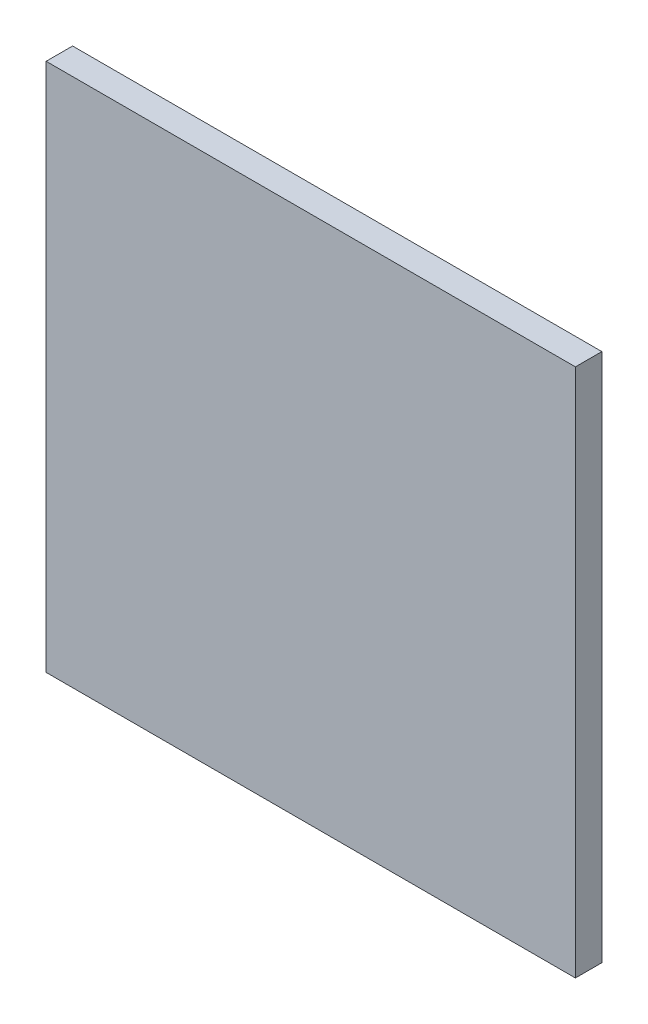
ISO-10303-21;
HEADER;
FILE_DESCRIPTION(('STEP AP214'),'2;1');
FILE_NAME('part.step','',(''),(''),'','','');
FILE_SCHEMA(('AUTOMOTIVE_DESIGN { 1 0 10303 214 1 1 1 1 }'));
ENDSEC;
DATA;
#1=APPLICATION_CONTEXT('core data for automotive mechanical design processes');
#2=APPLICATION_PROTOCOL_DEFINITION('international standard','automotive_design',2000,#1);
#3=PRODUCT_CONTEXT('',#1,'mechanical');
#4=PRODUCT('Part','Part','',(#3));
#5=PRODUCT_RELATED_PRODUCT_CATEGORY('part','',(#4));
#6=PRODUCT_DEFINITION_FORMATION('','',#4);
#7=PRODUCT_DEFINITION_CONTEXT('part definition',#1,'design');
#8=PRODUCT_DEFINITION('design','',#6,#7);
#9=PRODUCT_DEFINITION_SHAPE('','',#8);
#10=(LENGTH_UNIT() NAMED_UNIT(*) SI_UNIT(.MILLI.,.METRE.));
#11=(NAMED_UNIT(*) PLANE_ANGLE_UNIT() SI_UNIT($,.RADIAN.));
#12=(NAMED_UNIT(*) SI_UNIT($,.STERADIAN.) SOLID_ANGLE_UNIT());
#13=UNCERTAINTY_MEASURE_WITH_UNIT(LENGTH_MEASURE(1.E-05),#10,'distance_accuracy_value','');
#14=(GEOMETRIC_REPRESENTATION_CONTEXT(3) GLOBAL_UNCERTAINTY_ASSIGNED_CONTEXT((#13)) GLOBAL_UNIT_ASSIGNED_CONTEXT((#10,
#11,#12)) REPRESENTATION_CONTEXT('',''));
#15=CARTESIAN_POINT('',(0.,0.,0.));
#16=DIRECTION('',(0.,0.,1.));
#17=DIRECTION('',(1.,0.,0.));
#18=AXIS2_PLACEMENT_3D('',#15,#16,#17);
#19=CARTESIAN_POINT('',(-5.00000016,5.00000016,0.50009806));
#20=DIRECTION('',(0.,0.,1.));
#21=DIRECTION('',(1.,0.,0.));
#22=AXIS2_PLACEMENT_3D('',#19,#20,#21);
#23=PLANE('',#22);
#24=DIRECTION('',(0.,1.,0.));
#25=VECTOR('',#24,1.);
#26=CARTESIAN_POINT('',(5.00000016,5.00000016,0.50009806));
#27=LINE('',#26,#25);
#28=CARTESIAN_POINT('',(5.00000016,5.00000016,0.50009806));
#29=VERTEX_POINT('',#28);
#30=CARTESIAN_POINT('',(5.00000016,-5.00000016,0.50009806));
#31=VERTEX_POINT('',#30);
#32=EDGE_CURVE('E53',#29,#31,#27,.F.);
#33=ORIENTED_EDGE('',*,*,#32,.F.);
#34=DIRECTION('',(1.,0.,0.));
#35=VECTOR('',#34,1.);
#36=CARTESIAN_POINT('',(-5.00000016,5.00000016,0.50009806));
#37=LINE('',#36,#35);
#38=CARTESIAN_POINT('',(-5.00000016,5.00000016,0.50009806));
#39=VERTEX_POINT('',#38);
#40=EDGE_CURVE('E68',#39,#29,#37,.T.);
#41=ORIENTED_EDGE('',*,*,#40,.F.);
#42=DIRECTION('',(0.,1.,0.));
#43=VECTOR('',#42,1.);
#44=CARTESIAN_POINT('',(-5.00000016,-5.00000016,0.50009806));
#45=LINE('',#44,#43);
#46=CARTESIAN_POINT('',(-5.00000016,-5.00000016,0.50009806));
#47=VERTEX_POINT('',#46);
#48=EDGE_CURVE('E20',#47,#39,#45,.T.);
#49=ORIENTED_EDGE('',*,*,#48,.F.);
#50=DIRECTION('',(1.,0.,0.));
#51=VECTOR('',#50,1.);
#52=CARTESIAN_POINT('',(5.00000016,-5.00000016,0.50009806));
#53=LINE('',#52,#51);
#54=EDGE_CURVE('E58',#31,#47,#53,.F.);
#55=ORIENTED_EDGE('',*,*,#54,.F.);
#56=EDGE_LOOP('',(#33,#41,#49,#55));
#57=FACE_BOUND('',#56,.T.);
#58=ADVANCED_FACE('F17',(#57),#23,.T.);
#59=CARTESIAN_POINT('',(-5.00000016,-5.00000016,0.));
#60=DIRECTION('',(-1.,0.,0.));
#61=DIRECTION('',(0.,0.,1.));
#62=AXIS2_PLACEMENT_3D('',#59,#60,#61);
#63=PLANE('',#62);
#64=DIRECTION('',(0.,0.,1.));
#65=VECTOR('',#64,1.);
#66=CARTESIAN_POINT('',(-5.00000016,5.00000016,0.));
#67=LINE('',#66,#65);
#68=CARTESIAN_POINT('',(-5.00000016,5.00000016,0.));
#69=VERTEX_POINT('',#68);
#70=EDGE_CURVE('E79',#69,#39,#67,.T.);
#71=ORIENTED_EDGE('',*,*,#70,.F.);
#72=DIRECTION('',(0.,1.,0.));
#73=VECTOR('',#72,1.);
#74=CARTESIAN_POINT('',(-5.00000016,5.00000016,0.));
#75=LINE('',#74,#73);
#76=CARTESIAN_POINT('',(-5.00000016,-5.00000016,0.));
#77=VERTEX_POINT('',#76);
#78=EDGE_CURVE('E74',#69,#77,#75,.F.);
#79=ORIENTED_EDGE('',*,*,#78,.T.);
#80=DIRECTION('',(0.,0.,-1.));
#81=VECTOR('',#80,1.);
#82=CARTESIAN_POINT('',(-5.00000016,-5.00000016,0.));
#83=LINE('',#82,#81);
#84=EDGE_CURVE('E63',#47,#77,#83,.T.);
#85=ORIENTED_EDGE('',*,*,#84,.F.);
#86=ORIENTED_EDGE('',*,*,#48,.T.);
#87=EDGE_LOOP('',(#71,#79,#85,#86));
#88=FACE_BOUND('',#87,.T.);
#89=ADVANCED_FACE('F73',(#88),#63,.T.);
#90=CARTESIAN_POINT('',(5.00000016,-5.00000016,0.));
#91=DIRECTION('',(0.,-1.,0.));
#92=DIRECTION('',(0.,0.,-1.));
#93=AXIS2_PLACEMENT_3D('',#90,#91,#92);
#94=PLANE('',#93);
#95=ORIENTED_EDGE('',*,*,#84,.T.);
#96=DIRECTION('',(1.,0.,0.));
#97=VECTOR('',#96,1.);
#98=CARTESIAN_POINT('',(-5.00000016,-5.00000016,0.));
#99=LINE('',#98,#97);
#100=CARTESIAN_POINT('',(5.00000016,-5.00000016,0.));
#101=VERTEX_POINT('',#100);
#102=EDGE_CURVE('E84',#77,#101,#99,.T.);
#103=ORIENTED_EDGE('',*,*,#102,.T.);
#104=DIRECTION('',(0.,0.,-1.));
#105=VECTOR('',#104,1.);
#106=CARTESIAN_POINT('',(5.00000016,-5.00000016,0.));
#107=LINE('',#106,#105);
#108=EDGE_CURVE('E65',#31,#101,#107,.T.);
#109=ORIENTED_EDGE('',*,*,#108,.F.);
#110=ORIENTED_EDGE('',*,*,#54,.T.);
#111=EDGE_LOOP('',(#95,#103,#109,#110));
#112=FACE_BOUND('',#111,.T.);
#113=ADVANCED_FACE('F60',(#112),#94,.T.);
#114=CARTESIAN_POINT('',(5.00000016,5.00000016,0.));
#115=DIRECTION('',(1.,0.,0.));
#116=DIRECTION('',(0.,0.,-1.));
#117=AXIS2_PLACEMENT_3D('',#114,#115,#116);
#118=PLANE('',#117);
#119=ORIENTED_EDGE('',*,*,#108,.T.);
#120=DIRECTION('',(0.,1.,0.));
#121=VECTOR('',#120,1.);
#122=CARTESIAN_POINT('',(5.00000016,5.00000016,0.));
#123=LINE('',#122,#121);
#124=CARTESIAN_POINT('',(5.00000016,5.00000016,0.));
#125=VERTEX_POINT('',#124);
#126=EDGE_CURVE('E26',#101,#125,#123,.T.);
#127=ORIENTED_EDGE('',*,*,#126,.T.);
#128=DIRECTION('',(0.,0.,1.));
#129=VECTOR('',#128,1.);
#130=CARTESIAN_POINT('',(5.00000016,5.00000016,0.));
#131=LINE('',#130,#129);
#132=EDGE_CURVE('E34',#29,#125,#131,.F.);
#133=ORIENTED_EDGE('',*,*,#132,.F.);
#134=ORIENTED_EDGE('',*,*,#32,.T.);
#135=EDGE_LOOP('',(#119,#127,#133,#134));
#136=FACE_BOUND('',#135,.T.);
#137=ADVANCED_FACE('F88',(#136),#118,.T.);
#138=CARTESIAN_POINT('',(-5.00000016,5.00000016,0.));
#139=DIRECTION('',(0.,1.,0.));
#140=DIRECTION('',(0.,0.,1.));
#141=AXIS2_PLACEMENT_3D('',#138,#139,#140);
#142=PLANE('',#141);
#143=ORIENTED_EDGE('',*,*,#132,.T.);
#144=DIRECTION('',(1.,0.,0.));
#145=VECTOR('',#144,1.);
#146=CARTESIAN_POINT('',(-5.00000016,5.00000016,0.));
#147=LINE('',#146,#145);
#148=EDGE_CURVE('E11',#125,#69,#147,.F.);
#149=ORIENTED_EDGE('',*,*,#148,.T.);
#150=ORIENTED_EDGE('',*,*,#70,.T.);
#151=ORIENTED_EDGE('',*,*,#40,.T.);
#152=EDGE_LOOP('',(#143,#149,#150,#151));
#153=FACE_BOUND('',#152,.T.);
#154=ADVANCED_FACE('F91',(#153),#142,.T.);
#155=CARTESIAN_POINT('',(-5.00000016,5.00000016,0.));
#156=DIRECTION('',(0.,0.,1.));
#157=DIRECTION('',(1.,0.,0.));
#158=AXIS2_PLACEMENT_3D('',#155,#156,#157);
#159=PLANE('',#158);
#160=ORIENTED_EDGE('',*,*,#126,.F.);
#161=ORIENTED_EDGE('',*,*,#102,.F.);
#162=ORIENTED_EDGE('',*,*,#78,.F.);
#163=ORIENTED_EDGE('',*,*,#148,.F.);
#164=EDGE_LOOP('',(#160,#161,#162,#163));
#165=FACE_BOUND('',#164,.T.);
#166=ADVANCED_FACE('F90',(#165),#159,.F.);
#167=CLOSED_SHELL('',(#58,#89,#113,#137,#154,#166));
#168=MANIFOLD_SOLID_BREP('B1',#167);
#169=ADVANCED_BREP_SHAPE_REPRESENTATION('',(#18,#168),#14);
#170=SHAPE_DEFINITION_REPRESENTATION(#9,#169);
ENDSEC;
END-ISO-10303-21;
